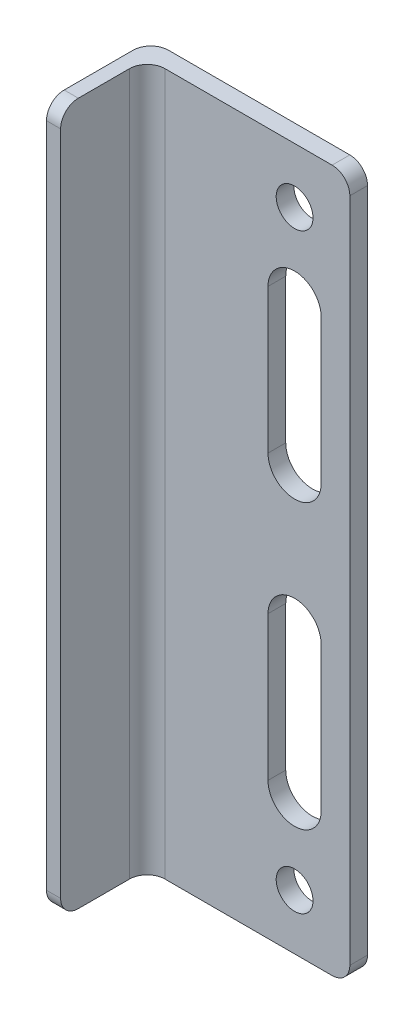
ISO-10303-21;
HEADER;
FILE_DESCRIPTION(('STEP AP214'),'2;1');
FILE_NAME('part.step','',(''),(''),'','','');
FILE_SCHEMA(('AUTOMOTIVE_DESIGN { 1 0 10303 214 1 1 1 1 }'));
ENDSEC;
DATA;
#1=APPLICATION_CONTEXT('core data for automotive mechanical design processes');
#2=APPLICATION_PROTOCOL_DEFINITION('international standard','automotive_design',2000,#1);
#3=PRODUCT_CONTEXT('',#1,'mechanical');
#4=PRODUCT('Part','Part','',(#3));
#5=PRODUCT_RELATED_PRODUCT_CATEGORY('part','',(#4));
#6=PRODUCT_DEFINITION_FORMATION('','',#4);
#7=PRODUCT_DEFINITION_CONTEXT('part definition',#1,'design');
#8=PRODUCT_DEFINITION('design','',#6,#7);
#9=PRODUCT_DEFINITION_SHAPE('','',#8);
#10=(LENGTH_UNIT() NAMED_UNIT(*) SI_UNIT(.MILLI.,.METRE.));
#11=(NAMED_UNIT(*) PLANE_ANGLE_UNIT() SI_UNIT($,.RADIAN.));
#12=(NAMED_UNIT(*) SI_UNIT($,.STERADIAN.) SOLID_ANGLE_UNIT());
#13=UNCERTAINTY_MEASURE_WITH_UNIT(LENGTH_MEASURE(1.E-05),#10,'distance_accuracy_value','');
#14=(GEOMETRIC_REPRESENTATION_CONTEXT(3) GLOBAL_UNCERTAINTY_ASSIGNED_CONTEXT((#13)) GLOBAL_UNIT_ASSIGNED_CONTEXT((#10,
#11,#12)) REPRESENTATION_CONTEXT('',''));
#15=CARTESIAN_POINT('',(0.,0.,0.));
#16=DIRECTION('',(0.,0.,1.));
#17=DIRECTION('',(1.,0.,0.));
#18=AXIS2_PLACEMENT_3D('',#15,#16,#17);
#19=CARTESIAN_POINT('',(0.,0.,3.175));
#20=DIRECTION('',(0.,0.,1.00000000000004));
#21=DIRECTION('',(1.,0.,0.));
#22=AXIS2_PLACEMENT_3D('',#19,#20,#21);
#23=PLANE('',#22);
#24=CARTESIAN_POINT('',(0.,38.337500033,3.17500000000026));
#25=DIRECTION('',(0.,0.,1.));
#26=DIRECTION('',(1.,0.,0.));
#27=AXIS2_PLACEMENT_3D('',#24,#25,#26);
#28=CIRCLE('',#27,4.7625);
#29=CARTESIAN_POINT('',(4.7625,38.337500033,3.17500000000017));
#30=VERTEX_POINT('',#29);
#31=CARTESIAN_POINT('',(-4.7625,38.337500033,3.17500000000027));
#32=VERTEX_POINT('',#31);
#33=EDGE_CURVE('E181',#30,#32,#28,.T.);
#34=ORIENTED_EDGE('',*,*,#33,.F.);
#35=DIRECTION('',(0.,1.,0.));
#36=VECTOR('',#35,1.);
#37=CARTESIAN_POINT('',(4.7625,38.337500033,3.17500000000008));
#38=LINE('',#37,#36);
#39=CARTESIAN_POINT('',(4.7625,12.462499967,3.17500000000009));
#40=VERTEX_POINT('',#39);
#41=EDGE_CURVE('E282',#40,#30,#38,.T.);
#42=ORIENTED_EDGE('',*,*,#41,.F.);
#43=CARTESIAN_POINT('',(0.,12.462499967,3.17500000000009));
#44=DIRECTION('',(0.,0.,1.));
#45=DIRECTION('',(1.,0.,0.));
#46=AXIS2_PLACEMENT_3D('',#43,#44,#45);
#47=CIRCLE('',#46,4.7625);
#48=CARTESIAN_POINT('',(-4.7625,12.462499967,3.17500000000018));
#49=VERTEX_POINT('',#48);
#50=EDGE_CURVE('E280',#49,#40,#47,.T.);
#51=ORIENTED_EDGE('',*,*,#50,.F.);
#52=DIRECTION('',(0.,1.,0.));
#53=VECTOR('',#52,1.);
#54=CARTESIAN_POINT('',(-4.7625,38.337500033,3.17500000000027));
#55=LINE('',#54,#53);
#56=EDGE_CURVE('E278',#32,#49,#55,.F.);
#57=ORIENTED_EDGE('',*,*,#56,.F.);
#58=EDGE_LOOP('',(#34,#42,#51,#57));
#59=FACE_BOUND('',#58,.T.);
#60=CARTESIAN_POINT('',(0.,-12.462499967,3.17499999999991));
#61=DIRECTION('',(0.,0.,1.));
#62=DIRECTION('',(1.,0.,0.));
#63=AXIS2_PLACEMENT_3D('',#60,#61,#62);
#64=CIRCLE('',#63,4.76249999999999);
#65=CARTESIAN_POINT('',(4.76249999999999,-12.462499967,3.17499999999982));
#66=VERTEX_POINT('',#65);
#67=CARTESIAN_POINT('',(-4.7625,-12.462499967,3.17499999999991));
#68=VERTEX_POINT('',#67);
#69=EDGE_CURVE('E275',#66,#68,#64,.T.);
#70=ORIENTED_EDGE('',*,*,#69,.F.);
#71=DIRECTION('',(0.,1.,0.));
#72=VECTOR('',#71,1.);
#73=CARTESIAN_POINT('',(4.76249999999999,-12.462499967,3.17499999999973));
#74=LINE('',#73,#72);
#75=CARTESIAN_POINT('',(4.7625,-38.337500033,3.17499999999973));
#76=VERTEX_POINT('',#75);
#77=EDGE_CURVE('E273',#76,#66,#74,.T.);
#78=ORIENTED_EDGE('',*,*,#77,.F.);
#79=CARTESIAN_POINT('',(0.,-38.337500033,3.17499999999974));
#80=DIRECTION('',(0.,0.,1.));
#81=DIRECTION('',(1.,0.,0.));
#82=AXIS2_PLACEMENT_3D('',#79,#80,#81);
#83=CIRCLE('',#82,4.76249999999999);
#84=CARTESIAN_POINT('',(-4.76249999999999,-38.337500033,3.17499999999983));
#85=VERTEX_POINT('',#84);
#86=EDGE_CURVE('E271',#85,#76,#83,.T.);
#87=ORIENTED_EDGE('',*,*,#86,.F.);
#88=DIRECTION('',(0.,-1.,0.));
#89=VECTOR('',#88,1.);
#90=CARTESIAN_POINT('',(-4.7625,-12.462499967,3.17499999999992));
#91=LINE('',#90,#89);
#92=EDGE_CURVE('E214',#68,#85,#91,.T.);
#93=ORIENTED_EDGE('',*,*,#92,.F.);
#94=EDGE_LOOP('',(#70,#78,#87,#93));
#95=FACE_BOUND('',#94,.T.);
#96=CARTESIAN_POINT('',(5.27355936696949E-13,53.0000000449997,3.17500000000067));
#97=DIRECTION('',(0.,0.,1.00000000000004));
#98=DIRECTION('',(1.,0.,0.));
#99=AXIS2_PLACEMENT_3D('',#96,#97,#98);
#100=CIRCLE('',#99,3.3);
#101=CARTESIAN_POINT('',(3.30000000000053,53.0000000449997,3.17500000000067));
#102=VERTEX_POINT('',#101);
#103=EDGE_CURVE('E236',#102,#102,#100,.T.);
#104=ORIENTED_EDGE('',*,*,#103,.F.);
#105=EDGE_LOOP('',(#104));
#106=FACE_BOUND('',#105,.T.);
#107=CARTESIAN_POINT('',(4.19109191795997E-12,-53.0000000450045,3.17500000000444));
#108=DIRECTION('',(0.,0.,1.00000000000004));
#109=DIRECTION('',(1.,0.,0.));
#110=AXIS2_PLACEMENT_3D('',#107,#108,#109);
#111=CIRCLE('',#110,3.3);
#112=CARTESIAN_POINT('',(3.30000000000419,-53.0000000450045,3.17500000000444));
#113=VERTEX_POINT('',#112);
#114=EDGE_CURVE('E239',#113,#113,#111,.T.);
#115=ORIENTED_EDGE('',*,*,#114,.F.);
#116=EDGE_LOOP('',(#115));
#117=FACE_BOUND('',#116,.T.);
#118=DIRECTION('',(-1.,0.,0.));
#119=VECTOR('',#118,1.);
#120=CARTESIAN_POINT('',(4.71844785465692E-13,62.9000000569999,3.17500000000022));
#121=LINE('',#120,#119);
#122=CARTESIAN_POINT('',(6.72500001200115,62.9000000569999,3.17500000000022));
#123=VERTEX_POINT('',#122);
#124=CARTESIAN_POINT('',(-23.2350000119998,62.9000000569999,3.17500000000023));
#125=VERTEX_POINT('',#124);
#126=EDGE_CURVE('E243',#123,#125,#121,.T.);
#127=ORIENTED_EDGE('',*,*,#126,.T.);
#128=DIRECTION('',(0.,-1.,0.));
#129=VECTOR('',#128,1.);
#130=CARTESIAN_POINT('',(-23.2350000119983,-62.9000000570045,3.17499999999936));
#131=LINE('',#130,#129);
#132=CARTESIAN_POINT('',(-23.2350000119983,-62.9000000570045,3.17500000000555));
#133=VERTEX_POINT('',#132);
#134=EDGE_CURVE('E330',#125,#133,#131,.T.);
#135=ORIENTED_EDGE('',*,*,#134,.T.);
#136=DIRECTION('',(-1.,0.,0.));
#137=VECTOR('',#136,1.);
#138=CARTESIAN_POINT('',(3.85802501057242E-12,-62.9000000570045,3.17500000000555));
#139=LINE('',#138,#137);
#140=CARTESIAN_POINT('',(6.7250000120008,-62.9000000570045,3.17500000000555));
#141=VERTEX_POINT('',#140);
#142=EDGE_CURVE('E245',#141,#133,#139,.T.);
#143=ORIENTED_EDGE('',*,*,#142,.F.);
#144=CARTESIAN_POINT('',(6.7250000120008,-59.7250000570045,3.17499999999957));
#145=DIRECTION('',(0.,0.,1.00000000000004));
#146=DIRECTION('',(0.,-1.,0.));
#147=AXIS2_PLACEMENT_3D('',#144,#145,#146);
#148=CIRCLE('',#147,3.175);
#149=CARTESIAN_POINT('',(9.9000000120008,-59.7250000570075,3.17500000000325));
#150=VERTEX_POINT('',#149);
#151=EDGE_CURVE('E297',#141,#150,#148,.T.);
#152=ORIENTED_EDGE('',*,*,#151,.T.);
#153=DIRECTION('',(0.,1.00000000000003,0.));
#154=VECTOR('',#153,1.);
#155=CARTESIAN_POINT('',(9.90000001200098,-1.346145417358E-12,3.17500000000278));
#156=LINE('',#155,#154);
#157=CARTESIAN_POINT('',(9.90000001200115,59.7250000570029,3.1750000000023));
#158=VERTEX_POINT('',#157);
#159=EDGE_CURVE('E248',#150,#158,#156,.T.);
#160=ORIENTED_EDGE('',*,*,#159,.T.);
#161=CARTESIAN_POINT('',(6.72500001200115,59.7250000569999,3.17500000000041));
#162=DIRECTION('',(0.,0.,1.00000000000004));
#163=DIRECTION('',(0.,-1.,0.));
#164=AXIS2_PLACEMENT_3D('',#161,#162,#163);
#165=CIRCLE('',#164,3.175);
#166=EDGE_CURVE('E295',#158,#123,#165,.T.);
#167=ORIENTED_EDGE('',*,*,#166,.T.);
#168=EDGE_LOOP('',(#127,#135,#143,#152,#160,#167));
#169=FACE_BOUND('',#168,.T.);
#170=ADVANCED_FACE('F34',(#59,#95,#106,#117,#169),#23,.T.);
#171=CARTESIAN_POINT('',(4.71844785465692E-13,62.9000000569999,3.17500000000022));
#172=DIRECTION('',(0.,-1.,0.));
#173=DIRECTION('',(1.,0.,0.));
#174=AXIS2_PLACEMENT_3D('',#171,#172,#173);
#175=PLANE('',#174);
#176=DIRECTION('',(0.,0.,-1.));
#177=VECTOR('',#176,1.);
#178=CARTESIAN_POINT('',(-28.9500000119998,62.900000057,3.17500000000033));
#179=LINE('',#178,#177);
#180=CARTESIAN_POINT('',(-28.9500000119998,62.900000057,15.525155132));
#181=VERTEX_POINT('',#180);
#182=CARTESIAN_POINT('',(-28.9500000119998,62.900000057,3.17500000000044));
#183=VERTEX_POINT('',#182);
#184=EDGE_CURVE('E266',#181,#183,#179,.T.);
#185=ORIENTED_EDGE('',*,*,#184,.F.);
#186=DIRECTION('',(1.,0.,0.));
#187=VECTOR('',#186,1.);
#188=CARTESIAN_POINT('',(4.71844785465692E-13,62.9000000569999,15.525155132));
#189=LINE('',#188,#187);
#190=CARTESIAN_POINT('',(-26.4100000119998,62.900000057,15.525155132));
#191=VERTEX_POINT('',#190);
#192=EDGE_CURVE('E326',#181,#191,#189,.T.);
#193=ORIENTED_EDGE('',*,*,#192,.T.);
#194=DIRECTION('',(0.,0.,-1.));
#195=VECTOR('',#194,1.);
#196=CARTESIAN_POINT('',(-26.4100000119998,62.900000057,18.700155132));
#197=LINE('',#196,#195);
#198=CARTESIAN_POINT('',(-26.4100000119998,62.900000057,6.35000000000058));
#199=VERTEX_POINT('',#198);
#200=EDGE_CURVE('E346',#191,#199,#197,.T.);
#201=ORIENTED_EDGE('',*,*,#200,.T.);
#202=CARTESIAN_POINT('',(-23.2350000119998,62.9000000569999,6.35000000000058));
#203=DIRECTION('',(0.,-1.,0.));
#204=DIRECTION('',(1.,0.,0.));
#205=AXIS2_PLACEMENT_3D('',#202,#203,#204);
#206=CIRCLE('',#205,3.175);
#207=EDGE_CURVE('E11',#199,#125,#206,.T.);
#208=ORIENTED_EDGE('',*,*,#207,.T.);
#209=ORIENTED_EDGE('',*,*,#126,.F.);
#210=DIRECTION('',(0.,0.,-1.));
#211=VECTOR('',#210,1.);
#212=CARTESIAN_POINT('',(6.72500001200115,62.9000000569999,3.17500000000022));
#213=LINE('',#212,#211);
#214=CARTESIAN_POINT('',(6.72500001200115,62.9000000569999,2.20924667446942E-13));
#215=VERTEX_POINT('',#214);
#216=EDGE_CURVE('E299',#123,#215,#213,.T.);
#217=ORIENTED_EDGE('',*,*,#216,.T.);
#218=DIRECTION('',(-1.,0.,0.));
#219=VECTOR('',#218,1.);
#220=CARTESIAN_POINT('',(4.71844785465692E-13,62.9000000569999,2.22044604925031E-13));
#221=LINE('',#220,#219);
#222=CARTESIAN_POINT('',(-25.7750000119999,62.9000000569999,2.26337004695987E-13));
#223=VERTEX_POINT('',#222);
#224=EDGE_CURVE('E258',#215,#223,#221,.T.);
#225=ORIENTED_EDGE('',*,*,#224,.T.);
#226=CARTESIAN_POINT('',(-25.7750000119999,62.9000000569999,3.17500000000044));
#227=DIRECTION('',(0.,-1.,0.));
#228=DIRECTION('',(1.,0.,0.));
#229=AXIS2_PLACEMENT_3D('',#226,#227,#228);
#230=CIRCLE('',#229,3.175);
#231=EDGE_CURVE('E324',#223,#183,#230,.F.);
#232=ORIENTED_EDGE('',*,*,#231,.T.);
#233=EDGE_LOOP('',(#185,#193,#201,#208,#209,#217,#225,#232));
#234=FACE_BOUND('',#233,.T.);
#235=ADVANCED_FACE('F352',(#234),#175,.F.);
#236=CARTESIAN_POINT('',(-28.950000012,0.,3.175));
#237=DIRECTION('',(1.,0.,0.));
#238=DIRECTION('',(0.,1.,0.));
#239=AXIS2_PLACEMENT_3D('',#236,#237,#238);
#240=PLANE('',#239);
#241=DIRECTION('',(0.,0.,-1.));
#242=VECTOR('',#241,1.);
#243=CARTESIAN_POINT('',(-28.9500000119983,-62.9000000570026,3.17500000000289));
#244=LINE('',#243,#242);
#245=CARTESIAN_POINT('',(-28.9500000119983,-62.9000000570026,15.525155132));
#246=VERTEX_POINT('',#245);
#247=CARTESIAN_POINT('',(-28.9500000119983,-62.9000000570026,3.17499999999956));
#248=VERTEX_POINT('',#247);
#249=EDGE_CURVE('E251',#246,#248,#244,.T.);
#250=ORIENTED_EDGE('',*,*,#249,.F.);
#251=CARTESIAN_POINT('',(-28.950000012,-59.7250000570045,15.525155132));
#252=DIRECTION('',(1.,0.,0.));
#253=DIRECTION('',(0.,1.,0.));
#254=AXIS2_PLACEMENT_3D('',#251,#252,#253);
#255=CIRCLE('',#254,3.175);
#256=CARTESIAN_POINT('',(-28.9500000119983,-59.7250000570045,18.700155132));
#257=VERTEX_POINT('',#256);
#258=EDGE_CURVE('E312',#246,#257,#255,.F.);
#259=ORIENTED_EDGE('',*,*,#258,.T.);
#260=DIRECTION('',(0.,-1.,0.));
#261=VECTOR('',#260,1.);
#262=CARTESIAN_POINT('',(-28.9500000119998,62.900000057,18.700155132));
#263=LINE('',#262,#261);
#264=CARTESIAN_POINT('',(-28.9500000119998,59.7250000569999,18.700155132));
#265=VERTEX_POINT('',#264);
#266=EDGE_CURVE('E384',#265,#257,#263,.T.);
#267=ORIENTED_EDGE('',*,*,#266,.F.);
#268=CARTESIAN_POINT('',(-28.9500000119999,59.7250000569999,15.525155132));
#269=DIRECTION('',(1.,0.,0.));
#270=DIRECTION('',(0.,1.,0.));
#271=AXIS2_PLACEMENT_3D('',#268,#269,#270);
#272=CIRCLE('',#271,3.175);
#273=EDGE_CURVE('E310',#265,#181,#272,.F.);
#274=ORIENTED_EDGE('',*,*,#273,.T.);
#275=ORIENTED_EDGE('',*,*,#184,.T.);
#276=DIRECTION('',(0.,-1.,0.));
#277=VECTOR('',#276,1.);
#278=CARTESIAN_POINT('',(-28.950000012,0.,3.175));
#279=LINE('',#278,#277);
#280=EDGE_CURVE('E307',#183,#248,#279,.T.);
#281=ORIENTED_EDGE('',*,*,#280,.T.);
#282=EDGE_LOOP('',(#250,#259,#267,#274,#275,#281));
#283=FACE_BOUND('',#282,.T.);
#284=ADVANCED_FACE('F371',(#283),#240,.F.);
#285=CARTESIAN_POINT('',(3.85802501057242E-12,-62.9000000570045,3.17500000000555));
#286=DIRECTION('',(0.,-1.,0.));
#287=DIRECTION('',(1.,0.,0.));
#288=AXIS2_PLACEMENT_3D('',#285,#286,#287);
#289=PLANE('',#288);
#290=DIRECTION('',(0.,0.,-1.));
#291=VECTOR('',#290,1.);
#292=CARTESIAN_POINT('',(-26.4100000119983,-62.9000000570026,18.700155132));
#293=LINE('',#292,#291);
#294=CARTESIAN_POINT('',(-26.4100000119983,-62.9000000570026,15.525155132));
#295=VERTEX_POINT('',#294);
#296=CARTESIAN_POINT('',(-26.4100000119983,-62.9000000570026,6.3499999999997));
#297=VERTEX_POINT('',#296);
#298=EDGE_CURVE('E205',#295,#297,#293,.T.);
#299=ORIENTED_EDGE('',*,*,#298,.F.);
#300=DIRECTION('',(-1.,0.,0.));
#301=VECTOR('',#300,1.);
#302=CARTESIAN_POINT('',(-28.9500000119983,-62.9000000570045,15.525155132));
#303=LINE('',#302,#301);
#304=EDGE_CURVE('E304',#295,#246,#303,.T.);
#305=ORIENTED_EDGE('',*,*,#304,.T.);
#306=ORIENTED_EDGE('',*,*,#249,.T.);
#307=CARTESIAN_POINT('',(-25.775000012,-62.9000000570045,3.17499999999956));
#308=DIRECTION('',(0.,-1.,0.));
#309=DIRECTION('',(1.,0.,0.));
#310=AXIS2_PLACEMENT_3D('',#307,#308,#309);
#311=CIRCLE('',#310,3.175);
#312=CARTESIAN_POINT('',(-25.775000012,-62.9000000570045,5.55540752289674E-12));
#313=VERTEX_POINT('',#312);
#314=EDGE_CURVE('E302',#248,#313,#311,.T.);
#315=ORIENTED_EDGE('',*,*,#314,.T.);
#316=DIRECTION('',(-1.,0.,0.));
#317=VECTOR('',#316,1.);
#318=CARTESIAN_POINT('',(3.85802501057242E-12,-62.9000000570045,5.55111512312578E-12));
#319=LINE('',#318,#317);
#320=CARTESIAN_POINT('',(6.7250000120008,-62.9000000570045,5.54999518564769E-12));
#321=VERTEX_POINT('',#320);
#322=EDGE_CURVE('E260',#321,#313,#319,.T.);
#323=ORIENTED_EDGE('',*,*,#322,.F.);
#324=DIRECTION('',(0.,0.,-1.));
#325=VECTOR('',#324,1.);
#326=CARTESIAN_POINT('',(6.7250000120008,-62.9000000570045,3.1750000000025));
#327=LINE('',#326,#325);
#328=EDGE_CURVE('E293',#321,#141,#327,.F.);
#329=ORIENTED_EDGE('',*,*,#328,.T.);
#330=ORIENTED_EDGE('',*,*,#142,.T.);
#331=CARTESIAN_POINT('',(-23.2350000119983,-62.9000000570045,6.3499999999997));
#332=DIRECTION('',(0.,-1.,0.));
#333=DIRECTION('',(1.,0.,0.));
#334=AXIS2_PLACEMENT_3D('',#331,#332,#333);
#335=CIRCLE('',#334,3.175);
#336=EDGE_CURVE('E42',#133,#297,#335,.F.);
#337=ORIENTED_EDGE('',*,*,#336,.T.);
#338=EDGE_LOOP('',(#299,#305,#306,#315,#323,#329,#330,#337));
#339=FACE_BOUND('',#338,.T.);
#340=ADVANCED_FACE('F335',(#339),#289,.T.);
#341=CARTESIAN_POINT('',(4.19109191795997E-12,-53.0000000450045,3.17500000000444));
#342=DIRECTION('',(0.,0.,-1.));
#343=DIRECTION('',(-1.,0.,0.));
#344=AXIS2_PLACEMENT_3D('',#341,#342,#343);
#345=CYLINDRICAL_SURFACE('',#344,3.3);
#346=ORIENTED_EDGE('',*,*,#114,.T.);
#347=EDGE_LOOP('',(#346));
#348=FACE_BOUND('',#347,.T.);
#349=CARTESIAN_POINT('',(4.19109191795997E-12,-53.0000000450045,4.44089209850063E-12));
#350=DIRECTION('',(0.,0.,1.00000000000004));
#351=DIRECTION('',(1.,0.,0.));
#352=AXIS2_PLACEMENT_3D('',#349,#350,#351);
#353=CIRCLE('',#352,3.3);
#354=CARTESIAN_POINT('',(3.30000000000419,-53.0000000450045,4.44034253810344E-12));
#355=VERTEX_POINT('',#354);
#356=EDGE_CURVE('E255',#355,#355,#353,.T.);
#357=ORIENTED_EDGE('',*,*,#356,.F.);
#358=EDGE_LOOP('',(#357));
#359=FACE_BOUND('',#358,.T.);
#360=ADVANCED_FACE('F417',(#348,#359),#345,.F.);
#361=CARTESIAN_POINT('',(5.27355936696949E-13,53.0000000449997,3.17500000000067));
#362=DIRECTION('',(0.,0.,-1.));
#363=DIRECTION('',(-1.,0.,0.));
#364=AXIS2_PLACEMENT_3D('',#361,#362,#363);
#365=CYLINDRICAL_SURFACE('',#364,3.3);
#366=ORIENTED_EDGE('',*,*,#103,.T.);
#367=EDGE_LOOP('',(#366));
#368=FACE_BOUND('',#367,.T.);
#369=CARTESIAN_POINT('',(5.27355936696949E-13,53.0000000449997,6.66133814775094E-13));
#370=DIRECTION('',(0.,0.,1.00000000000004));
#371=DIRECTION('',(1.,0.,0.));
#372=AXIS2_PLACEMENT_3D('',#369,#370,#371);
#373=CIRCLE('',#372,3.3);
#374=CARTESIAN_POINT('',(3.30000000000053,53.0000000449997,6.65584254377904E-13));
#375=VERTEX_POINT('',#374);
#376=EDGE_CURVE('E252',#375,#375,#373,.T.);
#377=ORIENTED_EDGE('',*,*,#376,.F.);
#378=EDGE_LOOP('',(#377));
#379=FACE_BOUND('',#378,.T.);
#380=ADVANCED_FACE('F414',(#368,#379),#365,.F.);
#381=CARTESIAN_POINT('',(9.90000001200098,-1.346145417358E-12,3.17500000000278));
#382=DIRECTION('',(-1.,0.,0.));
#383=DIRECTION('',(0.,-1.,0.));
#384=AXIS2_PLACEMENT_3D('',#381,#382,#383);
#385=PLANE('',#384);
#386=ORIENTED_EDGE('',*,*,#159,.F.);
#387=DIRECTION('',(0.,0.,-1.));
#388=VECTOR('',#387,1.);
#389=CARTESIAN_POINT('',(9.9000000120008,-59.7250000570045,2.4980018054066E-12));
#390=LINE('',#389,#388);
#391=CARTESIAN_POINT('',(9.9000000120008,-59.7250000570075,3.25131796531265E-12));
#392=VERTEX_POINT('',#391);
#393=EDGE_CURVE('E286',#150,#392,#390,.T.);
#394=ORIENTED_EDGE('',*,*,#393,.T.);
#395=DIRECTION('',(0.,1.00000000000003,0.));
#396=VECTOR('',#395,1.);
#397=CARTESIAN_POINT('',(9.90000001200098,-1.346145417358E-12,2.77555756156289E-12));
#398=LINE('',#397,#396);
#399=CARTESIAN_POINT('',(9.90000001200115,59.7250000570029,2.29979715781315E-12));
#400=VERTEX_POINT('',#399);
#401=EDGE_CURVE('E240',#392,#400,#398,.T.);
#402=ORIENTED_EDGE('',*,*,#401,.T.);
#403=DIRECTION('',(0.,0.,-1.));
#404=VECTOR('',#403,1.);
#405=CARTESIAN_POINT('',(9.90000001200115,59.7250000569999,3.17500000000278));
#406=LINE('',#405,#404);
#407=EDGE_CURVE('E269',#400,#158,#406,.F.);
#408=ORIENTED_EDGE('',*,*,#407,.T.);
#409=EDGE_LOOP('',(#386,#394,#402,#408));
#410=FACE_BOUND('',#409,.T.);
#411=ADVANCED_FACE('F359',(#410),#385,.F.);
#412=CARTESIAN_POINT('',(0.,0.,0.));
#413=DIRECTION('',(0.,0.,1.00000000000004));
#414=DIRECTION('',(1.,0.,0.));
#415=AXIS2_PLACEMENT_3D('',#412,#413,#414);
#416=PLANE('',#415);
#417=DIRECTION('',(0.,1.,0.));
#418=VECTOR('',#417,1.);
#419=CARTESIAN_POINT('',(4.7625,38.337500033,0.));
#420=LINE('',#419,#418);
#421=CARTESIAN_POINT('',(4.7625,12.462499967,0.));
#422=VERTEX_POINT('',#421);
#423=CARTESIAN_POINT('',(4.7625,38.337500033,0.));
#424=VERTEX_POINT('',#423);
#425=EDGE_CURVE('E185',#422,#424,#420,.T.);
#426=ORIENTED_EDGE('',*,*,#425,.T.);
#427=CARTESIAN_POINT('',(0.,38.337500033,0.));
#428=DIRECTION('',(0.,0.,1.));
#429=DIRECTION('',(1.,0.,0.));
#430=AXIS2_PLACEMENT_3D('',#427,#428,#429);
#431=CIRCLE('',#430,4.7625);
#432=CARTESIAN_POINT('',(-4.7625,38.337500033,0.));
#433=VERTEX_POINT('',#432);
#434=EDGE_CURVE('E178',#424,#433,#431,.T.);
#435=ORIENTED_EDGE('',*,*,#434,.T.);
#436=DIRECTION('',(0.,-1.,0.));
#437=VECTOR('',#436,1.);
#438=CARTESIAN_POINT('',(-4.7625,38.337500033,0.));
#439=LINE('',#438,#437);
#440=CARTESIAN_POINT('',(-4.7625,12.462499967,0.));
#441=VERTEX_POINT('',#440);
#442=EDGE_CURVE('E189',#433,#441,#439,.T.);
#443=ORIENTED_EDGE('',*,*,#442,.T.);
#444=CARTESIAN_POINT('',(0.,12.462499967,0.));
#445=DIRECTION('',(0.,0.,1.));
#446=DIRECTION('',(1.,0.,0.));
#447=AXIS2_PLACEMENT_3D('',#444,#445,#446);
#448=CIRCLE('',#447,4.7625);
#449=EDGE_CURVE('E194',#441,#422,#448,.T.);
#450=ORIENTED_EDGE('',*,*,#449,.T.);
#451=EDGE_LOOP('',(#426,#435,#443,#450));
#452=FACE_BOUND('',#451,.T.);
#453=DIRECTION('',(0.,1.,0.));
#454=VECTOR('',#453,1.);
#455=CARTESIAN_POINT('',(4.76249999999999,-12.462499967,0.));
#456=LINE('',#455,#454);
#457=CARTESIAN_POINT('',(4.7625,-38.337500033,0.));
#458=VERTEX_POINT('',#457);
#459=CARTESIAN_POINT('',(4.76249999999999,-12.462499967,0.));
#460=VERTEX_POINT('',#459);
#461=EDGE_CURVE('E226',#458,#460,#456,.T.);
#462=ORIENTED_EDGE('',*,*,#461,.T.);
#463=CARTESIAN_POINT('',(0.,-12.462499967,0.));
#464=DIRECTION('',(0.,0.,1.));
#465=DIRECTION('',(1.,0.,0.));
#466=AXIS2_PLACEMENT_3D('',#463,#464,#465);
#467=CIRCLE('',#466,4.76249999999999);
#468=CARTESIAN_POINT('',(-4.7625,-12.462499967,0.));
#469=VERTEX_POINT('',#468);
#470=EDGE_CURVE('E217',#460,#469,#467,.T.);
#471=ORIENTED_EDGE('',*,*,#470,.T.);
#472=DIRECTION('',(0.,-1.,0.));
#473=VECTOR('',#472,1.);
#474=CARTESIAN_POINT('',(-4.7625,-12.462499967,0.));
#475=LINE('',#474,#473);
#476=CARTESIAN_POINT('',(-4.76249999999999,-38.337500033,-2.62464009090792E-13));
#477=VERTEX_POINT('',#476);
#478=EDGE_CURVE('E220',#469,#477,#475,.T.);
#479=ORIENTED_EDGE('',*,*,#478,.T.);
#480=CARTESIAN_POINT('',(0.,-38.337500033,0.));
#481=DIRECTION('',(0.,0.,1.));
#482=DIRECTION('',(1.,0.,0.));
#483=AXIS2_PLACEMENT_3D('',#480,#481,#482);
#484=CIRCLE('',#483,4.76249999999999);
#485=EDGE_CURVE('E223',#477,#458,#484,.T.);
#486=ORIENTED_EDGE('',*,*,#485,.T.);
#487=EDGE_LOOP('',(#462,#471,#479,#486));
#488=FACE_BOUND('',#487,.T.);
#489=ORIENTED_EDGE('',*,*,#376,.T.);
#490=EDGE_LOOP('',(#489));
#491=FACE_BOUND('',#490,.T.);
#492=ORIENTED_EDGE('',*,*,#356,.T.);
#493=EDGE_LOOP('',(#492));
#494=FACE_BOUND('',#493,.T.);
#495=ORIENTED_EDGE('',*,*,#322,.T.);
#496=DIRECTION('',(0.,-1.,0.));
#497=VECTOR('',#496,1.);
#498=CARTESIAN_POINT('',(-25.775000012,0.,0.));
#499=LINE('',#498,#497);
#500=EDGE_CURVE('E49',#313,#223,#499,.F.);
#501=ORIENTED_EDGE('',*,*,#500,.T.);
#502=ORIENTED_EDGE('',*,*,#224,.F.);
#503=CARTESIAN_POINT('',(6.72500001200115,59.7250000569999,4.09828421199521E-13));
#504=DIRECTION('',(0.,0.,1.00000000000004));
#505=DIRECTION('',(0.,-1.,0.));
#506=AXIS2_PLACEMENT_3D('',#503,#504,#505);
#507=CIRCLE('',#506,3.175);
#508=EDGE_CURVE('E289',#215,#400,#507,.F.);
#509=ORIENTED_EDGE('',*,*,#508,.T.);
#510=ORIENTED_EDGE('',*,*,#401,.F.);
#511=CARTESIAN_POINT('',(6.7250000120008,-59.7250000570045,-4.25874613352306E-13));
#512=DIRECTION('',(0.,0.,1.00000000000004));
#513=DIRECTION('',(0.,-1.,0.));
#514=AXIS2_PLACEMENT_3D('',#511,#512,#513);
#515=CIRCLE('',#514,3.175);
#516=EDGE_CURVE('E291',#392,#321,#515,.F.);
#517=ORIENTED_EDGE('',*,*,#516,.T.);
#518=EDGE_LOOP('',(#495,#501,#502,#509,#510,#517));
#519=FACE_BOUND('',#518,.T.);
#520=ADVANCED_FACE('F196',(#452,#488,#491,#494,#519),#416,.F.);
#521=CARTESIAN_POINT('',(0.,-12.462499967,0.));
#522=DIRECTION('',(0.,0.,1.));
#523=DIRECTION('',(1.,0.,0.));
#524=AXIS2_PLACEMENT_3D('',#521,#522,#523);
#525=CYLINDRICAL_SURFACE('',#524,4.76249999999999);
#526=ORIENTED_EDGE('',*,*,#69,.T.);
#527=DIRECTION('',(0.,0.,1.));
#528=VECTOR('',#527,1.);
#529=CARTESIAN_POINT('',(-4.7625,-12.462499967,0.));
#530=LINE('',#529,#528);
#531=EDGE_CURVE('E229',#469,#68,#530,.T.);
#532=ORIENTED_EDGE('',*,*,#531,.F.);
#533=ORIENTED_EDGE('',*,*,#470,.F.);
#534=DIRECTION('',(0.,0.,1.));
#535=VECTOR('',#534,1.);
#536=CARTESIAN_POINT('',(4.76249999999999,-12.462499967,0.));
#537=LINE('',#536,#535);
#538=EDGE_CURVE('E199',#460,#66,#537,.T.);
#539=ORIENTED_EDGE('',*,*,#538,.T.);
#540=EDGE_LOOP('',(#526,#532,#533,#539));
#541=FACE_BOUND('',#540,.T.);
#542=ADVANCED_FACE('F408',(#541),#525,.F.);
#543=CARTESIAN_POINT('',(4.76249999999999,-12.462499967,0.));
#544=DIRECTION('',(1.,0.,0.));
#545=DIRECTION('',(0.,1.,0.));
#546=AXIS2_PLACEMENT_3D('',#543,#544,#545);
#547=PLANE('',#546);
#548=ORIENTED_EDGE('',*,*,#77,.T.);
#549=ORIENTED_EDGE('',*,*,#538,.F.);
#550=ORIENTED_EDGE('',*,*,#461,.F.);
#551=DIRECTION('',(0.,0.,1.));
#552=VECTOR('',#551,1.);
#553=CARTESIAN_POINT('',(4.7625,-38.337500033,0.));
#554=LINE('',#553,#552);
#555=EDGE_CURVE('E202',#458,#76,#554,.T.);
#556=ORIENTED_EDGE('',*,*,#555,.T.);
#557=EDGE_LOOP('',(#548,#549,#550,#556));
#558=FACE_BOUND('',#557,.T.);
#559=ADVANCED_FACE('F448',(#558),#547,.F.);
#560=CARTESIAN_POINT('',(0.,-38.337500033,0.));
#561=DIRECTION('',(0.,0.,1.));
#562=DIRECTION('',(1.,0.,0.));
#563=AXIS2_PLACEMENT_3D('',#560,#561,#562);
#564=CYLINDRICAL_SURFACE('',#563,4.76249999999999);
#565=ORIENTED_EDGE('',*,*,#86,.T.);
#566=ORIENTED_EDGE('',*,*,#555,.F.);
#567=ORIENTED_EDGE('',*,*,#485,.F.);
#568=DIRECTION('',(0.,0.,1.));
#569=VECTOR('',#568,1.);
#570=CARTESIAN_POINT('',(-4.76249999999999,-38.337500033,0.));
#571=LINE('',#570,#569);
#572=EDGE_CURVE('E231',#477,#85,#571,.T.);
#573=ORIENTED_EDGE('',*,*,#572,.T.);
#574=EDGE_LOOP('',(#565,#566,#567,#573));
#575=FACE_BOUND('',#574,.T.);
#576=ADVANCED_FACE('F451',(#575),#564,.F.);
#577=CARTESIAN_POINT('',(-4.7625,-12.462499967,0.));
#578=DIRECTION('',(-1.,0.,0.));
#579=DIRECTION('',(0.,-1.,0.));
#580=AXIS2_PLACEMENT_3D('',#577,#578,#579);
#581=PLANE('',#580);
#582=ORIENTED_EDGE('',*,*,#92,.T.);
#583=ORIENTED_EDGE('',*,*,#572,.F.);
#584=ORIENTED_EDGE('',*,*,#478,.F.);
#585=ORIENTED_EDGE('',*,*,#531,.T.);
#586=EDGE_LOOP('',(#582,#583,#584,#585));
#587=FACE_BOUND('',#586,.T.);
#588=ADVANCED_FACE('F447',(#587),#581,.F.);
#589=CARTESIAN_POINT('',(0.,38.337500033,0.));
#590=DIRECTION('',(0.,0.,1.));
#591=DIRECTION('',(1.,0.,0.));
#592=AXIS2_PLACEMENT_3D('',#589,#590,#591);
#593=CYLINDRICAL_SURFACE('',#592,4.7625);
#594=ORIENTED_EDGE('',*,*,#33,.T.);
#595=DIRECTION('',(0.,0.,1.));
#596=VECTOR('',#595,1.);
#597=CARTESIAN_POINT('',(-4.7625,38.337500033,0.));
#598=LINE('',#597,#596);
#599=EDGE_CURVE('E173',#433,#32,#598,.T.);
#600=ORIENTED_EDGE('',*,*,#599,.F.);
#601=ORIENTED_EDGE('',*,*,#434,.F.);
#602=DIRECTION('',(0.,0.,1.));
#603=VECTOR('',#602,1.);
#604=CARTESIAN_POINT('',(4.7625,38.337500033,0.));
#605=LINE('',#604,#603);
#606=EDGE_CURVE('E213',#424,#30,#605,.T.);
#607=ORIENTED_EDGE('',*,*,#606,.T.);
#608=EDGE_LOOP('',(#594,#600,#601,#607));
#609=FACE_BOUND('',#608,.T.);
#610=ADVANCED_FACE('F175',(#609),#593,.F.);
#611=CARTESIAN_POINT('',(4.7625,38.337500033,0.));
#612=DIRECTION('',(1.,0.,0.));
#613=DIRECTION('',(0.,0.,-1.));
#614=AXIS2_PLACEMENT_3D('',#611,#612,#613);
#615=PLANE('',#614);
#616=ORIENTED_EDGE('',*,*,#41,.T.);
#617=ORIENTED_EDGE('',*,*,#606,.F.);
#618=ORIENTED_EDGE('',*,*,#425,.F.);
#619=DIRECTION('',(0.,0.,1.));
#620=VECTOR('',#619,1.);
#621=CARTESIAN_POINT('',(4.7625,12.462499967,0.));
#622=LINE('',#621,#620);
#623=EDGE_CURVE('E210',#422,#40,#622,.T.);
#624=ORIENTED_EDGE('',*,*,#623,.T.);
#625=EDGE_LOOP('',(#616,#617,#618,#624));
#626=FACE_BOUND('',#625,.T.);
#627=ADVANCED_FACE('F435',(#626),#615,.F.);
#628=CARTESIAN_POINT('',(0.,12.462499967,0.));
#629=DIRECTION('',(0.,0.,1.));
#630=DIRECTION('',(1.,0.,0.));
#631=AXIS2_PLACEMENT_3D('',#628,#629,#630);
#632=CYLINDRICAL_SURFACE('',#631,4.7625);
#633=ORIENTED_EDGE('',*,*,#50,.T.);
#634=ORIENTED_EDGE('',*,*,#623,.F.);
#635=ORIENTED_EDGE('',*,*,#449,.F.);
#636=DIRECTION('',(0.,0.,1.));
#637=VECTOR('',#636,1.);
#638=CARTESIAN_POINT('',(-4.7625,12.462499967,0.));
#639=LINE('',#638,#637);
#640=EDGE_CURVE('E184',#441,#49,#639,.T.);
#641=ORIENTED_EDGE('',*,*,#640,.T.);
#642=EDGE_LOOP('',(#633,#634,#635,#641));
#643=FACE_BOUND('',#642,.T.);
#644=ADVANCED_FACE('F438',(#643),#632,.F.);
#645=CARTESIAN_POINT('',(-4.7625,38.337500033,0.));
#646=DIRECTION('',(-1.,0.,0.));
#647=DIRECTION('',(0.,0.,1.));
#648=AXIS2_PLACEMENT_3D('',#645,#646,#647);
#649=PLANE('',#648);
#650=ORIENTED_EDGE('',*,*,#56,.T.);
#651=ORIENTED_EDGE('',*,*,#640,.F.);
#652=ORIENTED_EDGE('',*,*,#442,.F.);
#653=ORIENTED_EDGE('',*,*,#599,.T.);
#654=EDGE_LOOP('',(#650,#651,#652,#653));
#655=FACE_BOUND('',#654,.T.);
#656=ADVANCED_FACE('F190',(#655),#649,.F.);
#657=CARTESIAN_POINT('',(6.7250000120008,-59.7250000570045,3.17500000000278));
#658=DIRECTION('',(0.,0.,1.));
#659=DIRECTION('',(1.,0.,0.));
#660=AXIS2_PLACEMENT_3D('',#657,#658,#659);
#661=CYLINDRICAL_SURFACE('',#660,3.175);
#662=ORIENTED_EDGE('',*,*,#151,.F.);
#663=ORIENTED_EDGE('',*,*,#328,.F.);
#664=ORIENTED_EDGE('',*,*,#516,.F.);
#665=ORIENTED_EDGE('',*,*,#393,.F.);
#666=EDGE_LOOP('',(#662,#663,#664,#665));
#667=FACE_BOUND('',#666,.T.);
#668=ADVANCED_FACE('F362',(#667),#661,.T.);
#669=CARTESIAN_POINT('',(6.72500001200115,59.7250000569999,3.17500000000022));
#670=DIRECTION('',(0.,0.,-1.));
#671=DIRECTION('',(-1.,0.,0.));
#672=AXIS2_PLACEMENT_3D('',#669,#670,#671);
#673=CYLINDRICAL_SURFACE('',#672,3.175);
#674=ORIENTED_EDGE('',*,*,#166,.F.);
#675=ORIENTED_EDGE('',*,*,#407,.F.);
#676=ORIENTED_EDGE('',*,*,#508,.F.);
#677=ORIENTED_EDGE('',*,*,#216,.F.);
#678=EDGE_LOOP('',(#674,#675,#676,#677));
#679=FACE_BOUND('',#678,.T.);
#680=ADVANCED_FACE('F354',(#679),#673,.T.);
#681=CARTESIAN_POINT('',(-26.4100000119998,62.900000057,18.700155132));
#682=DIRECTION('',(1.,0.,0.));
#683=DIRECTION('',(0.,1.,0.));
#684=AXIS2_PLACEMENT_3D('',#681,#682,#683);
#685=PLANE('',#684);
#686=DIRECTION('',(0.,-1.,0.));
#687=VECTOR('',#686,1.);
#688=CARTESIAN_POINT('',(-26.4100000119998,62.900000057,18.700155132));
#689=LINE('',#688,#687);
#690=CARTESIAN_POINT('',(-26.4100000119998,59.7250000569999,18.700155132));
#691=VERTEX_POINT('',#690);
#692=CARTESIAN_POINT('',(-26.4100000119983,-59.7250000570045,18.700155132));
#693=VERTEX_POINT('',#692);
#694=EDGE_CURVE('E379',#691,#693,#689,.T.);
#695=ORIENTED_EDGE('',*,*,#694,.T.);
#696=CARTESIAN_POINT('',(-26.4100000119983,-59.7250000570045,15.525155132));
#697=DIRECTION('',(1.,0.,0.));
#698=DIRECTION('',(0.,1.,0.));
#699=AXIS2_PLACEMENT_3D('',#696,#697,#698);
#700=CIRCLE('',#699,3.175);
#701=EDGE_CURVE('E322',#693,#295,#700,.T.);
#702=ORIENTED_EDGE('',*,*,#701,.T.);
#703=ORIENTED_EDGE('',*,*,#298,.T.);
#704=DIRECTION('',(0.,-1.,0.));
#705=VECTOR('',#704,1.);
#706=CARTESIAN_POINT('',(-26.4100000119998,62.900000057,6.35000000000058));
#707=LINE('',#706,#705);
#708=EDGE_CURVE('E318',#297,#199,#707,.F.);
#709=ORIENTED_EDGE('',*,*,#708,.T.);
#710=ORIENTED_EDGE('',*,*,#200,.F.);
#711=CARTESIAN_POINT('',(-26.4100000119998,59.7250000569999,15.525155132));
#712=DIRECTION('',(1.,0.,0.));
#713=DIRECTION('',(0.,1.,0.));
#714=AXIS2_PLACEMENT_3D('',#711,#712,#713);
#715=CIRCLE('',#714,3.175);
#716=EDGE_CURVE('E320',#191,#691,#715,.T.);
#717=ORIENTED_EDGE('',*,*,#716,.T.);
#718=EDGE_LOOP('',(#695,#702,#703,#709,#710,#717));
#719=FACE_BOUND('',#718,.T.);
#720=ADVANCED_FACE('F343',(#719),#685,.T.);
#721=CARTESIAN_POINT('',(0.,0.,18.700155132));
#722=DIRECTION('',(0.,0.,-1.));
#723=DIRECTION('',(-1.,0.,0.));
#724=AXIS2_PLACEMENT_3D('',#721,#722,#723);
#725=PLANE('',#724);
#726=ORIENTED_EDGE('',*,*,#266,.T.);
#727=DIRECTION('',(-1.,0.,0.));
#728=VECTOR('',#727,1.);
#729=CARTESIAN_POINT('',(-26.4100000119983,-59.7250000570045,18.700155132));
#730=LINE('',#729,#728);
#731=EDGE_CURVE('E316',#257,#693,#730,.F.);
#732=ORIENTED_EDGE('',*,*,#731,.T.);
#733=ORIENTED_EDGE('',*,*,#694,.F.);
#734=DIRECTION('',(1.,0.,0.));
#735=VECTOR('',#734,1.);
#736=CARTESIAN_POINT('',(0.,59.7250000569999,18.700155132));
#737=LINE('',#736,#735);
#738=EDGE_CURVE('E314',#691,#265,#737,.F.);
#739=ORIENTED_EDGE('',*,*,#738,.T.);
#740=EDGE_LOOP('',(#726,#732,#733,#739));
#741=FACE_BOUND('',#740,.T.);
#742=ADVANCED_FACE('F382',(#741),#725,.F.);
#743=CARTESIAN_POINT('',(3.85591003571051E-12,-59.7250000570045,15.525155132));
#744=DIRECTION('',(1.,0.,0.));
#745=DIRECTION('',(0.,1.,0.));
#746=AXIS2_PLACEMENT_3D('',#743,#744,#745);
#747=CYLINDRICAL_SURFACE('',#746,3.175);
#748=ORIENTED_EDGE('',*,*,#701,.F.);
#749=ORIENTED_EDGE('',*,*,#731,.F.);
#750=ORIENTED_EDGE('',*,*,#258,.F.);
#751=ORIENTED_EDGE('',*,*,#304,.F.);
#752=EDGE_LOOP('',(#748,#749,#750,#751));
#753=FACE_BOUND('',#752,.T.);
#754=ADVANCED_FACE('F388',(#753),#747,.T.);
#755=CARTESIAN_POINT('',(4.73959760327602E-13,59.7250000569999,15.525155132));
#756=DIRECTION('',(1.,0.,0.));
#757=DIRECTION('',(0.,1.,0.));
#758=AXIS2_PLACEMENT_3D('',#755,#756,#757);
#759=CYLINDRICAL_SURFACE('',#758,3.175);
#760=ORIENTED_EDGE('',*,*,#273,.F.);
#761=ORIENTED_EDGE('',*,*,#738,.F.);
#762=ORIENTED_EDGE('',*,*,#716,.F.);
#763=ORIENTED_EDGE('',*,*,#192,.F.);
#764=EDGE_LOOP('',(#760,#761,#762,#763));
#765=FACE_BOUND('',#764,.T.);
#766=ADVANCED_FACE('F376',(#765),#759,.T.);
#767=CARTESIAN_POINT('',(-25.775000012,0.,3.175));
#768=DIRECTION('',(0.,-1.,0.));
#769=DIRECTION('',(0.,0.,-1.));
#770=AXIS2_PLACEMENT_3D('',#767,#768,#769);
#771=CYLINDRICAL_SURFACE('',#770,3.175);
#772=ORIENTED_EDGE('',*,*,#231,.F.);
#773=ORIENTED_EDGE('',*,*,#500,.F.);
#774=ORIENTED_EDGE('',*,*,#314,.F.);
#775=ORIENTED_EDGE('',*,*,#280,.F.);
#776=EDGE_LOOP('',(#772,#773,#774,#775));
#777=FACE_BOUND('',#776,.T.);
#778=ADVANCED_FACE('F369',(#777),#771,.T.);
#779=CARTESIAN_POINT('',(-23.235000011999,-2.99032698336224E-13,6.35000000000014));
#780=DIRECTION('',(0.,1.,0.));
#781=DIRECTION('',(-1.,0.,0.));
#782=AXIS2_PLACEMENT_3D('',#779,#780,#781);
#783=CYLINDRICAL_SURFACE('',#782,3.175);
#784=ORIENTED_EDGE('',*,*,#207,.F.);
#785=ORIENTED_EDGE('',*,*,#708,.F.);
#786=ORIENTED_EDGE('',*,*,#336,.F.);
#787=ORIENTED_EDGE('',*,*,#134,.F.);
#788=EDGE_LOOP('',(#784,#785,#786,#787));
#789=FACE_BOUND('',#788,.T.);
#790=ADVANCED_FACE('F36',(#789),#783,.F.);
#791=CLOSED_SHELL('',(#170,#235,#284,#340,#360,#380,#411,#520,#542,#559,#576,#588,#610,#627,
#644,#656,#668,#680,#720,#742,#754,#766,#778,#790));
#792=MANIFOLD_SOLID_BREP('B2',#791);
#793=ADVANCED_BREP_SHAPE_REPRESENTATION('',(#18,#792),#14);
#794=SHAPE_DEFINITION_REPRESENTATION(#9,#793);
ENDSEC;
END-ISO-10303-21;
